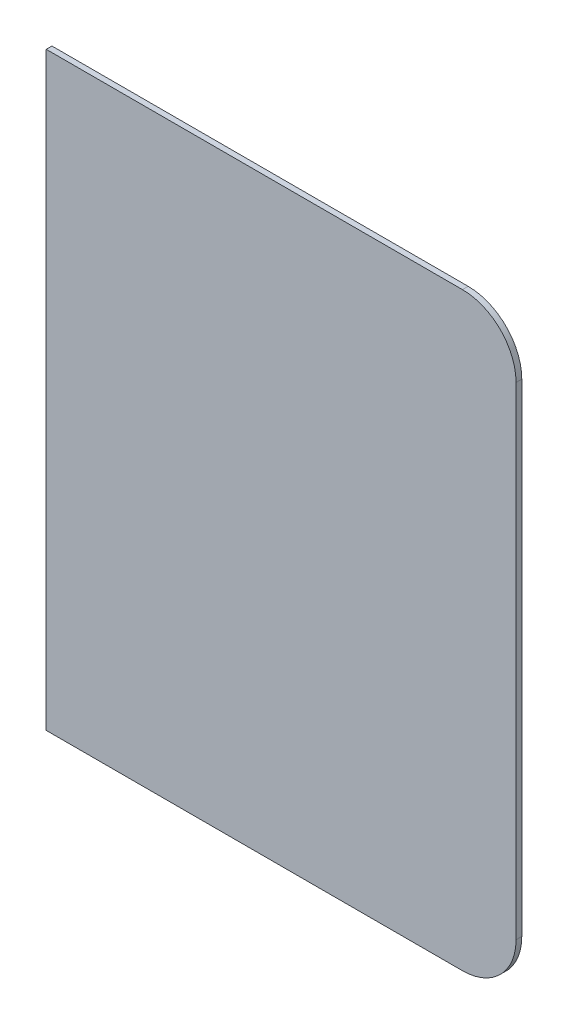
ISO-10303-21;
HEADER;
FILE_DESCRIPTION(('STEP AP214'),'2;1');
FILE_NAME('part.step','',(''),(''),'','','');
FILE_SCHEMA(('AUTOMOTIVE_DESIGN { 1 0 10303 214 1 1 1 1 }'));
ENDSEC;
DATA;
#1=APPLICATION_CONTEXT('core data for automotive mechanical design processes');
#2=APPLICATION_PROTOCOL_DEFINITION('international standard','automotive_design',2000,#1);
#3=PRODUCT_CONTEXT('',#1,'mechanical');
#4=PRODUCT('Part','Part','',(#3));
#5=PRODUCT_RELATED_PRODUCT_CATEGORY('part','',(#4));
#6=PRODUCT_DEFINITION_FORMATION('','',#4);
#7=PRODUCT_DEFINITION_CONTEXT('part definition',#1,'design');
#8=PRODUCT_DEFINITION('design','',#6,#7);
#9=PRODUCT_DEFINITION_SHAPE('','',#8);
#10=(LENGTH_UNIT() NAMED_UNIT(*) SI_UNIT(.MILLI.,.METRE.));
#11=(NAMED_UNIT(*) PLANE_ANGLE_UNIT() SI_UNIT($,.RADIAN.));
#12=(NAMED_UNIT(*) SI_UNIT($,.STERADIAN.) SOLID_ANGLE_UNIT());
#13=UNCERTAINTY_MEASURE_WITH_UNIT(LENGTH_MEASURE(1.E-05),#10,'distance_accuracy_value','');
#14=(GEOMETRIC_REPRESENTATION_CONTEXT(3) GLOBAL_UNCERTAINTY_ASSIGNED_CONTEXT((#13)) GLOBAL_UNIT_ASSIGNED_CONTEXT((#10,
#11,#12)) REPRESENTATION_CONTEXT('',''));
#15=CARTESIAN_POINT('',(0.,0.,0.));
#16=DIRECTION('',(0.,0.,1.));
#17=DIRECTION('',(1.,0.,0.));
#18=AXIS2_PLACEMENT_3D('',#15,#16,#17);
#19=CARTESIAN_POINT('',(17.1516731332455,511.627538889502,-121.285023565587));
#20=DIRECTION('',(-1.,0.,0.));
#21=DIRECTION('',(0.,-1.,0.));
#22=AXIS2_PLACEMENT_3D('',#19,#20,#21);
#23=PLANE('',#22);
#24=DIRECTION('',(0.,0.,1.));
#25=VECTOR('',#24,1.);
#26=CARTESIAN_POINT('',(17.1516731332454,410.,268.2));
#27=LINE('',#26,#25);
#28=CARTESIAN_POINT('',(17.1516731332454,410.,265.));
#29=VERTEX_POINT('',#28);
#30=CARTESIAN_POINT('',(17.1516731332454,410.,268.2));
#31=VERTEX_POINT('',#30);
#32=EDGE_CURVE('E39',#29,#31,#27,.T.);
#33=ORIENTED_EDGE('',*,*,#32,.F.);
#34=DIRECTION('',(0.,1.,0.));
#35=VECTOR('',#34,1.);
#36=CARTESIAN_POINT('',(17.1516731332454,450.,265.));
#37=LINE('',#36,#35);
#38=CARTESIAN_POINT('',(17.1516731332454,80.,265.));
#39=VERTEX_POINT('',#38);
#40=EDGE_CURVE('E118',#39,#29,#37,.T.);
#41=ORIENTED_EDGE('',*,*,#40,.F.);
#42=DIRECTION('',(0.,0.,-1.));
#43=VECTOR('',#42,1.);
#44=CARTESIAN_POINT('',(17.1516731332455,80.,268.2));
#45=LINE('',#44,#43);
#46=CARTESIAN_POINT('',(17.1516731332454,80.,268.2));
#47=VERTEX_POINT('',#46);
#48=EDGE_CURVE('E119',#47,#39,#45,.T.);
#49=ORIENTED_EDGE('',*,*,#48,.F.);
#50=DIRECTION('',(0.,1.,0.));
#51=VECTOR('',#50,1.);
#52=CARTESIAN_POINT('',(17.1516731332454,450.,268.2));
#53=LINE('',#52,#51);
#54=EDGE_CURVE('E11',#47,#31,#53,.T.);
#55=ORIENTED_EDGE('',*,*,#54,.T.);
#56=EDGE_LOOP('',(#33,#41,#49,#55));
#57=FACE_BOUND('',#56,.T.);
#58=ADVANCED_FACE('F36',(#57),#23,.T.);
#59=CARTESIAN_POINT('',(250.,410.,268.2));
#60=DIRECTION('',(0.,1.,0.));
#61=DIRECTION('',(-1.,0.,0.));
#62=AXIS2_PLACEMENT_3D('',#59,#60,#61);
#63=PLANE('',#62);
#64=DIRECTION('',(1.,0.,0.));
#65=VECTOR('',#64,1.);
#66=CARTESIAN_POINT('',(-250.,410.,265.));
#67=LINE('',#66,#65);
#68=CARTESIAN_POINT('',(250.,410.,265.));
#69=VERTEX_POINT('',#68);
#70=EDGE_CURVE('E98',#29,#69,#67,.T.);
#71=ORIENTED_EDGE('',*,*,#70,.F.);
#72=ORIENTED_EDGE('',*,*,#32,.T.);
#73=DIRECTION('',(1.,0.,0.));
#74=VECTOR('',#73,1.);
#75=CARTESIAN_POINT('',(-250.,410.,268.2));
#76=LINE('',#75,#74);
#77=CARTESIAN_POINT('',(250.,410.,268.2));
#78=VERTEX_POINT('',#77);
#79=EDGE_CURVE('E59',#31,#78,#76,.T.);
#80=ORIENTED_EDGE('',*,*,#79,.T.);
#81=DIRECTION('',(0.,0.,-1.));
#82=VECTOR('',#81,1.);
#83=CARTESIAN_POINT('',(250.,410.,268.2));
#84=LINE('',#83,#82);
#85=EDGE_CURVE('E120',#78,#69,#84,.T.);
#86=ORIENTED_EDGE('',*,*,#85,.T.);
#87=EDGE_LOOP('',(#71,#72,#80,#86));
#88=FACE_BOUND('',#87,.T.);
#89=ADVANCED_FACE('F124',(#88),#63,.T.);
#90=CARTESIAN_POINT('',(250.,380.,268.2));
#91=DIRECTION('',(0.,0.,-1.));
#92=DIRECTION('',(-1.,0.,0.));
#93=AXIS2_PLACEMENT_3D('',#90,#91,#92);
#94=CYLINDRICAL_SURFACE('',#93,30.);
#95=CARTESIAN_POINT('',(250.,380.,265.));
#96=DIRECTION('',(0.,0.,-1.));
#97=DIRECTION('',(-1.,0.,0.));
#98=AXIS2_PLACEMENT_3D('',#95,#96,#97);
#99=CIRCLE('',#98,30.);
#100=CARTESIAN_POINT('',(280.,380.,265.));
#101=VERTEX_POINT('',#100);
#102=EDGE_CURVE('E134',#69,#101,#99,.T.);
#103=ORIENTED_EDGE('',*,*,#102,.F.);
#104=ORIENTED_EDGE('',*,*,#85,.F.);
#105=CARTESIAN_POINT('',(250.,380.,268.2));
#106=DIRECTION('',(0.,0.,-1.));
#107=DIRECTION('',(-1.,0.,0.));
#108=AXIS2_PLACEMENT_3D('',#105,#106,#107);
#109=CIRCLE('',#108,30.);
#110=CARTESIAN_POINT('',(280.,380.,268.2));
#111=VERTEX_POINT('',#110);
#112=EDGE_CURVE('E114',#78,#111,#109,.T.);
#113=ORIENTED_EDGE('',*,*,#112,.T.);
#114=DIRECTION('',(0.,0.,-1.));
#115=VECTOR('',#114,1.);
#116=CARTESIAN_POINT('',(280.,380.,268.2));
#117=LINE('',#116,#115);
#118=EDGE_CURVE('E140',#111,#101,#117,.T.);
#119=ORIENTED_EDGE('',*,*,#118,.T.);
#120=EDGE_LOOP('',(#103,#104,#113,#119));
#121=FACE_BOUND('',#120,.T.);
#122=ADVANCED_FACE('F144',(#121),#94,.T.);
#123=CARTESIAN_POINT('',(280.,380.,268.2));
#124=DIRECTION('',(1.,0.,0.));
#125=DIRECTION('',(0.,1.,0.));
#126=AXIS2_PLACEMENT_3D('',#123,#124,#125);
#127=PLANE('',#126);
#128=DIRECTION('',(0.,-1.,0.));
#129=VECTOR('',#128,1.);
#130=CARTESIAN_POINT('',(280.,450.,265.));
#131=LINE('',#130,#129);
#132=CARTESIAN_POINT('',(280.,110.,265.));
#133=VERTEX_POINT('',#132);
#134=EDGE_CURVE('E133',#101,#133,#131,.T.);
#135=ORIENTED_EDGE('',*,*,#134,.F.);
#136=ORIENTED_EDGE('',*,*,#118,.F.);
#137=DIRECTION('',(0.,-1.,0.));
#138=VECTOR('',#137,1.);
#139=CARTESIAN_POINT('',(280.,450.,268.2));
#140=LINE('',#139,#138);
#141=CARTESIAN_POINT('',(280.,110.,268.2));
#142=VERTEX_POINT('',#141);
#143=EDGE_CURVE('E105',#111,#142,#140,.T.);
#144=ORIENTED_EDGE('',*,*,#143,.T.);
#145=DIRECTION('',(0.,0.,-1.));
#146=VECTOR('',#145,1.);
#147=CARTESIAN_POINT('',(280.,110.,268.2));
#148=LINE('',#147,#146);
#149=EDGE_CURVE('E97',#142,#133,#148,.T.);
#150=ORIENTED_EDGE('',*,*,#149,.T.);
#151=EDGE_LOOP('',(#135,#136,#144,#150));
#152=FACE_BOUND('',#151,.T.);
#153=ADVANCED_FACE('F146',(#152),#127,.T.);
#154=CARTESIAN_POINT('',(250.,110.,268.2));
#155=DIRECTION('',(0.,0.,-1.));
#156=DIRECTION('',(-1.,0.,0.));
#157=AXIS2_PLACEMENT_3D('',#154,#155,#156);
#158=CYLINDRICAL_SURFACE('',#157,30.);
#159=CARTESIAN_POINT('',(250.,110.,265.));
#160=DIRECTION('',(0.,0.,-1.));
#161=DIRECTION('',(-1.,0.,0.));
#162=AXIS2_PLACEMENT_3D('',#159,#160,#161);
#163=CIRCLE('',#162,30.);
#164=CARTESIAN_POINT('',(250.,80.,265.));
#165=VERTEX_POINT('',#164);
#166=EDGE_CURVE('E109',#133,#165,#163,.T.);
#167=ORIENTED_EDGE('',*,*,#166,.F.);
#168=ORIENTED_EDGE('',*,*,#149,.F.);
#169=CARTESIAN_POINT('',(250.,110.,268.2));
#170=DIRECTION('',(0.,0.,-1.));
#171=DIRECTION('',(-1.,0.,0.));
#172=AXIS2_PLACEMENT_3D('',#169,#170,#171);
#173=CIRCLE('',#172,30.);
#174=CARTESIAN_POINT('',(250.,80.,268.2));
#175=VERTEX_POINT('',#174);
#176=EDGE_CURVE('E101',#142,#175,#173,.T.);
#177=ORIENTED_EDGE('',*,*,#176,.T.);
#178=DIRECTION('',(0.,0.,-1.));
#179=VECTOR('',#178,1.);
#180=CARTESIAN_POINT('',(250.,80.,268.2));
#181=LINE('',#180,#179);
#182=EDGE_CURVE('E89',#175,#165,#181,.T.);
#183=ORIENTED_EDGE('',*,*,#182,.T.);
#184=EDGE_LOOP('',(#167,#168,#177,#183));
#185=FACE_BOUND('',#184,.T.);
#186=ADVANCED_FACE('F102',(#185),#158,.T.);
#187=CARTESIAN_POINT('',(250.,80.,268.2));
#188=DIRECTION('',(0.,-1.,0.));
#189=DIRECTION('',(1.,0.,0.));
#190=AXIS2_PLACEMENT_3D('',#187,#188,#189);
#191=PLANE('',#190);
#192=DIRECTION('',(-1.,0.,0.));
#193=VECTOR('',#192,1.);
#194=CARTESIAN_POINT('',(-250.,80.,268.2));
#195=LINE('',#194,#193);
#196=EDGE_CURVE('E51',#175,#47,#195,.T.);
#197=ORIENTED_EDGE('',*,*,#196,.T.);
#198=ORIENTED_EDGE('',*,*,#48,.T.);
#199=DIRECTION('',(-1.,0.,0.));
#200=VECTOR('',#199,1.);
#201=CARTESIAN_POINT('',(-250.,80.,265.));
#202=LINE('',#201,#200);
#203=EDGE_CURVE('E93',#165,#39,#202,.T.);
#204=ORIENTED_EDGE('',*,*,#203,.F.);
#205=ORIENTED_EDGE('',*,*,#182,.F.);
#206=EDGE_LOOP('',(#197,#198,#204,#205));
#207=FACE_BOUND('',#206,.T.);
#208=ADVANCED_FACE('F91',(#207),#191,.T.);
#209=CARTESIAN_POINT('',(-250.,450.,268.2));
#210=DIRECTION('',(0.,0.,-1.));
#211=DIRECTION('',(-1.,0.,0.));
#212=AXIS2_PLACEMENT_3D('',#209,#210,#211);
#213=PLANE('',#212);
#214=ORIENTED_EDGE('',*,*,#54,.F.);
#215=ORIENTED_EDGE('',*,*,#196,.F.);
#216=ORIENTED_EDGE('',*,*,#176,.F.);
#217=ORIENTED_EDGE('',*,*,#143,.F.);
#218=ORIENTED_EDGE('',*,*,#112,.F.);
#219=ORIENTED_EDGE('',*,*,#79,.F.);
#220=EDGE_LOOP('',(#214,#215,#216,#217,#218,#219));
#221=FACE_BOUND('',#220,.T.);
#222=ADVANCED_FACE('F107',(#221),#213,.F.);
#223=CARTESIAN_POINT('',(-250.,450.,265.));
#224=DIRECTION('',(0.,0.,-1.));
#225=DIRECTION('',(-1.,0.,0.));
#226=AXIS2_PLACEMENT_3D('',#223,#224,#225);
#227=PLANE('',#226);
#228=ORIENTED_EDGE('',*,*,#203,.T.);
#229=ORIENTED_EDGE('',*,*,#40,.T.);
#230=ORIENTED_EDGE('',*,*,#70,.T.);
#231=ORIENTED_EDGE('',*,*,#102,.T.);
#232=ORIENTED_EDGE('',*,*,#134,.T.);
#233=ORIENTED_EDGE('',*,*,#166,.T.);
#234=EDGE_LOOP('',(#228,#229,#230,#231,#232,#233));
#235=FACE_BOUND('',#234,.T.);
#236=ADVANCED_FACE('F129',(#235),#227,.T.);
#237=CLOSED_SHELL('',(#58,#89,#122,#153,#186,#208,#222,#236));
#238=MANIFOLD_SOLID_BREP('B2',#237);
#239=ADVANCED_BREP_SHAPE_REPRESENTATION('',(#18,#238),#14);
#240=SHAPE_DEFINITION_REPRESENTATION(#9,#239);
ENDSEC;
END-ISO-10303-21;
